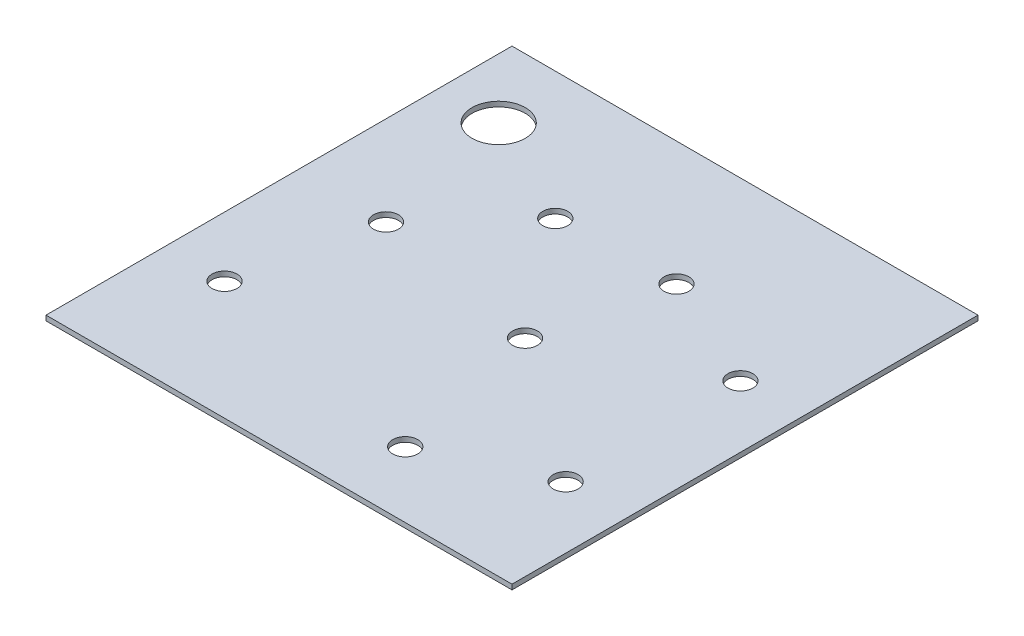
ISO-10303-21;
HEADER;
FILE_DESCRIPTION(('STEP AP214'),'2;1');
FILE_NAME('part.step','',(''),(''),'','','');
FILE_SCHEMA(('AUTOMOTIVE_DESIGN { 1 0 10303 214 1 1 1 1 }'));
ENDSEC;
DATA;
#1=APPLICATION_CONTEXT('core data for automotive mechanical design processes');
#2=APPLICATION_PROTOCOL_DEFINITION('international standard','automotive_design',2000,#1);
#3=PRODUCT_CONTEXT('',#1,'mechanical');
#4=PRODUCT('Part','Part','',(#3));
#5=PRODUCT_RELATED_PRODUCT_CATEGORY('part','',(#4));
#6=PRODUCT_DEFINITION_FORMATION('','',#4);
#7=PRODUCT_DEFINITION_CONTEXT('part definition',#1,'design');
#8=PRODUCT_DEFINITION('design','',#6,#7);
#9=PRODUCT_DEFINITION_SHAPE('','',#8);
#10=(LENGTH_UNIT() NAMED_UNIT(*) SI_UNIT(.MILLI.,.METRE.));
#11=(NAMED_UNIT(*) PLANE_ANGLE_UNIT() SI_UNIT($,.RADIAN.));
#12=(NAMED_UNIT(*) SI_UNIT($,.STERADIAN.) SOLID_ANGLE_UNIT());
#13=UNCERTAINTY_MEASURE_WITH_UNIT(LENGTH_MEASURE(1.E-05),#10,'distance_accuracy_value','');
#14=(GEOMETRIC_REPRESENTATION_CONTEXT(3) GLOBAL_UNCERTAINTY_ASSIGNED_CONTEXT((#13)) GLOBAL_UNIT_ASSIGNED_CONTEXT((#10,
#11,#12)) REPRESENTATION_CONTEXT('',''));
#15=CARTESIAN_POINT('',(0.,0.,0.));
#16=DIRECTION('',(0.,0.,1.));
#17=DIRECTION('',(1.,0.,0.));
#18=AXIS2_PLACEMENT_3D('',#15,#16,#17);
#19=CARTESIAN_POINT('',(0.,1.5,0.));
#20=DIRECTION('',(0.,-1.,0.));
#21=DIRECTION('',(0.,0.,-1.));
#22=AXIS2_PLACEMENT_3D('',#19,#20,#21);
#23=PLANE('',#22);
#24=DIRECTION('',(0.,0.,-1.));
#25=VECTOR('',#24,1.);
#26=CARTESIAN_POINT('',(140.,1.5,140.));
#27=LINE('',#26,#25);
#28=CARTESIAN_POINT('',(140.,1.5,140.));
#29=VERTEX_POINT('',#28);
#30=CARTESIAN_POINT('',(140.,1.5,-140.));
#31=VERTEX_POINT('',#30);
#32=EDGE_CURVE('E99',#29,#31,#27,.T.);
#33=ORIENTED_EDGE('',*,*,#32,.T.);
#34=DIRECTION('',(-1.,0.,0.));
#35=VECTOR('',#34,1.);
#36=CARTESIAN_POINT('',(-140.,1.5,-140.));
#37=LINE('',#36,#35);
#38=CARTESIAN_POINT('',(-140.,1.5,-140.));
#39=VERTEX_POINT('',#38);
#40=EDGE_CURVE('E94',#31,#39,#37,.T.);
#41=ORIENTED_EDGE('',*,*,#40,.T.);
#42=DIRECTION('',(0.,0.,1.));
#43=VECTOR('',#42,1.);
#44=CARTESIAN_POINT('',(-140.,1.5,140.));
#45=LINE('',#44,#43);
#46=CARTESIAN_POINT('',(-140.,1.5,140.));
#47=VERTEX_POINT('',#46);
#48=EDGE_CURVE('E97',#39,#47,#45,.T.);
#49=ORIENTED_EDGE('',*,*,#48,.T.);
#50=DIRECTION('',(1.,0.,0.));
#51=VECTOR('',#50,1.);
#52=CARTESIAN_POINT('',(-140.,1.5,140.));
#53=LINE('',#52,#51);
#54=EDGE_CURVE('E64',#47,#29,#53,.T.);
#55=ORIENTED_EDGE('',*,*,#54,.T.);
#56=EDGE_LOOP('',(#33,#41,#49,#55));
#57=FACE_BOUND('',#56,.T.);
#58=CARTESIAN_POINT('',(-104.,1.5,-96.));
#59=DIRECTION('',(0.,1.,0.));
#60=DIRECTION('',(0.,0.,1.));
#61=AXIS2_PLACEMENT_3D('',#58,#59,#60);
#62=CIRCLE('',#61,16.);
#63=CARTESIAN_POINT('',(-104.,1.5,-80.));
#64=VERTEX_POINT('',#63);
#65=EDGE_CURVE('E114',#64,#64,#62,.T.);
#66=ORIENTED_EDGE('',*,*,#65,.F.);
#67=EDGE_LOOP('',(#66));
#68=FACE_BOUND('',#67,.T.);
#69=CARTESIAN_POINT('',(-86.3455044477865,1.5,-10.6300925090027));
#70=DIRECTION('',(0.,1.,0.));
#71=DIRECTION('',(0.,0.,1.));
#72=AXIS2_PLACEMENT_3D('',#69,#70,#71);
#73=CIRCLE('',#72,7.50000000000001);
#74=CARTESIAN_POINT('',(-86.3455044477865,1.5,-3.13009250900271));
#75=VERTEX_POINT('',#74);
#76=EDGE_CURVE('E129',#75,#75,#73,.T.);
#77=ORIENTED_EDGE('',*,*,#76,.F.);
#78=EDGE_LOOP('',(#77));
#79=FACE_BOUND('',#78,.T.);
#80=CARTESIAN_POINT('',(-104.,1.5,68.745612268935));
#81=DIRECTION('',(0.,1.,0.));
#82=DIRECTION('',(0.,0.,1.));
#83=AXIS2_PLACEMENT_3D('',#80,#81,#82);
#84=CIRCLE('',#83,7.50000000000001);
#85=CARTESIAN_POINT('',(-104.,1.5,76.245612268935));
#86=VERTEX_POINT('',#85);
#87=EDGE_CURVE('E135',#86,#86,#84,.T.);
#88=ORIENTED_EDGE('',*,*,#87,.F.);
#89=EDGE_LOOP('',(#88));
#90=FACE_BOUND('',#89,.T.);
#91=CARTESIAN_POINT('',(36.4243113079733,1.5,100.557665156591));
#92=DIRECTION('',(0.,1.,0.));
#93=DIRECTION('',(0.,0.,1.));
#94=AXIS2_PLACEMENT_3D('',#91,#92,#93);
#95=CIRCLE('',#94,7.5);
#96=CARTESIAN_POINT('',(36.4243113079733,1.5,108.057665156591));
#97=VERTEX_POINT('',#96);
#98=EDGE_CURVE('E141',#97,#97,#95,.T.);
#99=ORIENTED_EDGE('',*,*,#98,.F.);
#100=EDGE_LOOP('',(#99));
#101=FACE_BOUND('',#100,.T.);
#102=CARTESIAN_POINT('',(15.8854616280789,1.5,8.05562787646512));
#103=DIRECTION('',(0.,1.,0.));
#104=DIRECTION('',(0.,0.,1.));
#105=AXIS2_PLACEMENT_3D('',#102,#103,#104);
#106=CIRCLE('',#105,7.5);
#107=CARTESIAN_POINT('',(15.8854616280789,1.5,15.5556278764651));
#108=VERTEX_POINT('',#107);
#109=EDGE_CURVE('E147',#108,#108,#106,.T.);
#110=ORIENTED_EDGE('',*,*,#109,.F.);
#111=EDGE_LOOP('',(#110));
#112=FACE_BOUND('',#111,.T.);
#113=CARTESIAN_POINT('',(33.2267289377524,1.5,-65.5847023670324));
#114=DIRECTION('',(0.,1.,0.));
#115=DIRECTION('',(0.,0.,1.));
#116=AXIS2_PLACEMENT_3D('',#113,#114,#115);
#117=CIRCLE('',#116,7.5);
#118=CARTESIAN_POINT('',(33.2267289377524,1.5,-58.0847023670324));
#119=VERTEX_POINT('',#118);
#120=EDGE_CURVE('E153',#119,#119,#117,.T.);
#121=ORIENTED_EDGE('',*,*,#120,.F.);
#122=EDGE_LOOP('',(#121));
#123=FACE_BOUND('',#122,.T.);
#124=CARTESIAN_POINT('',(102.828111024925,1.5,-34.4119184541435));
#125=DIRECTION('',(0.,1.,0.));
#126=DIRECTION('',(0.,0.,1.));
#127=AXIS2_PLACEMENT_3D('',#124,#125,#126);
#128=CIRCLE('',#127,7.50000000000001);
#129=CARTESIAN_POINT('',(102.828111024925,1.5,-26.9119184541435));
#130=VERTEX_POINT('',#129);
#131=EDGE_CURVE('E159',#130,#130,#128,.T.);
#132=ORIENTED_EDGE('',*,*,#131,.F.);
#133=EDGE_LOOP('',(#132));
#134=FACE_BOUND('',#133,.T.);
#135=CARTESIAN_POINT('',(102.828111024925,1.5,70.5987415633617));
#136=DIRECTION('',(0.,1.,0.));
#137=DIRECTION('',(0.,0.,1.));
#138=AXIS2_PLACEMENT_3D('',#135,#136,#137);
#139=CIRCLE('',#138,7.50000000000001);
#140=CARTESIAN_POINT('',(102.828111024925,1.5,78.0987415633617));
#141=VERTEX_POINT('',#140);
#142=EDGE_CURVE('E165',#141,#141,#139,.T.);
#143=ORIENTED_EDGE('',*,*,#142,.F.);
#144=EDGE_LOOP('',(#143));
#145=FACE_BOUND('',#144,.T.);
#146=CARTESIAN_POINT('',(-37.2960519367656,1.5,-63.2892870863749));
#147=DIRECTION('',(0.,1.,0.));
#148=DIRECTION('',(0.,0.,1.));
#149=AXIS2_PLACEMENT_3D('',#146,#147,#148);
#150=CIRCLE('',#149,7.5);
#151=CARTESIAN_POINT('',(-37.2960519367656,1.5,-55.7892870863749));
#152=VERTEX_POINT('',#151);
#153=EDGE_CURVE('E171',#152,#152,#150,.T.);
#154=ORIENTED_EDGE('',*,*,#153,.F.);
#155=EDGE_LOOP('',(#154));
#156=FACE_BOUND('',#155,.T.);
#157=ADVANCED_FACE('F47',(#57,#68,#79,#90,#101,#112,#123,#134,#145,#156),#23,.F.);
#158=CARTESIAN_POINT('',(0.,-1.5,0.));
#159=DIRECTION('',(0.,-1.,0.));
#160=DIRECTION('',(0.,0.,-1.));
#161=AXIS2_PLACEMENT_3D('',#158,#159,#160);
#162=PLANE('',#161);
#163=CARTESIAN_POINT('',(102.828111024925,-1.5,70.5987415633617));
#164=DIRECTION('',(0.,1.,0.));
#165=DIRECTION('',(0.,0.,1.));
#166=AXIS2_PLACEMENT_3D('',#163,#164,#165);
#167=CIRCLE('',#166,7.50000000000001);
#168=CARTESIAN_POINT('',(102.828111024925,-1.5,78.0987415633617));
#169=VERTEX_POINT('',#168);
#170=EDGE_CURVE('E168',#169,#169,#167,.T.);
#171=ORIENTED_EDGE('',*,*,#170,.T.);
#172=EDGE_LOOP('',(#171));
#173=FACE_BOUND('',#172,.T.);
#174=CARTESIAN_POINT('',(33.2267289377524,-1.5,-65.5847023670324));
#175=DIRECTION('',(0.,1.,0.));
#176=DIRECTION('',(0.,0.,1.));
#177=AXIS2_PLACEMENT_3D('',#174,#175,#176);
#178=CIRCLE('',#177,7.5);
#179=CARTESIAN_POINT('',(33.2267289377524,-1.5,-58.0847023670324));
#180=VERTEX_POINT('',#179);
#181=EDGE_CURVE('E156',#180,#180,#178,.T.);
#182=ORIENTED_EDGE('',*,*,#181,.T.);
#183=EDGE_LOOP('',(#182));
#184=FACE_BOUND('',#183,.T.);
#185=CARTESIAN_POINT('',(36.4243113079733,-1.5,100.557665156591));
#186=DIRECTION('',(0.,1.,0.));
#187=DIRECTION('',(0.,0.,1.));
#188=AXIS2_PLACEMENT_3D('',#185,#186,#187);
#189=CIRCLE('',#188,7.5);
#190=CARTESIAN_POINT('',(36.4243113079733,-1.5,108.057665156591));
#191=VERTEX_POINT('',#190);
#192=EDGE_CURVE('E144',#191,#191,#189,.T.);
#193=ORIENTED_EDGE('',*,*,#192,.T.);
#194=EDGE_LOOP('',(#193));
#195=FACE_BOUND('',#194,.T.);
#196=CARTESIAN_POINT('',(-86.3455044477865,-1.5,-10.6300925090027));
#197=DIRECTION('',(0.,1.,0.));
#198=DIRECTION('',(0.,0.,1.));
#199=AXIS2_PLACEMENT_3D('',#196,#197,#198);
#200=CIRCLE('',#199,7.50000000000001);
#201=CARTESIAN_POINT('',(-86.3455044477865,-1.5,-3.13009250900271));
#202=VERTEX_POINT('',#201);
#203=EDGE_CURVE('E132',#202,#202,#200,.T.);
#204=ORIENTED_EDGE('',*,*,#203,.T.);
#205=EDGE_LOOP('',(#204));
#206=FACE_BOUND('',#205,.T.);
#207=DIRECTION('',(0.,0.,-1.));
#208=VECTOR('',#207,1.);
#209=CARTESIAN_POINT('',(140.,-1.5,140.));
#210=LINE('',#209,#208);
#211=CARTESIAN_POINT('',(140.,-1.5,140.));
#212=VERTEX_POINT('',#211);
#213=CARTESIAN_POINT('',(140.,-1.5,-140.));
#214=VERTEX_POINT('',#213);
#215=EDGE_CURVE('E111',#212,#214,#210,.T.);
#216=ORIENTED_EDGE('',*,*,#215,.F.);
#217=DIRECTION('',(1.,0.,0.));
#218=VECTOR('',#217,1.);
#219=CARTESIAN_POINT('',(-140.,-1.5,140.));
#220=LINE('',#219,#218);
#221=CARTESIAN_POINT('',(-140.,-1.5,140.));
#222=VERTEX_POINT('',#221);
#223=EDGE_CURVE('E87',#222,#212,#220,.T.);
#224=ORIENTED_EDGE('',*,*,#223,.F.);
#225=DIRECTION('',(0.,0.,1.));
#226=VECTOR('',#225,1.);
#227=CARTESIAN_POINT('',(-140.,-1.5,140.));
#228=LINE('',#227,#226);
#229=CARTESIAN_POINT('',(-140.,-1.5,-140.));
#230=VERTEX_POINT('',#229);
#231=EDGE_CURVE('E81',#230,#222,#228,.T.);
#232=ORIENTED_EDGE('',*,*,#231,.F.);
#233=DIRECTION('',(-1.,0.,0.));
#234=VECTOR('',#233,1.);
#235=CARTESIAN_POINT('',(-140.,-1.5,-140.));
#236=LINE('',#235,#234);
#237=EDGE_CURVE('E103',#214,#230,#236,.T.);
#238=ORIENTED_EDGE('',*,*,#237,.F.);
#239=EDGE_LOOP('',(#216,#224,#232,#238));
#240=FACE_BOUND('',#239,.T.);
#241=CARTESIAN_POINT('',(-104.,-1.5,-96.));
#242=DIRECTION('',(0.,1.,0.));
#243=DIRECTION('',(0.,0.,1.));
#244=AXIS2_PLACEMENT_3D('',#241,#242,#243);
#245=CIRCLE('',#244,16.);
#246=CARTESIAN_POINT('',(-104.,-1.5,-80.));
#247=VERTEX_POINT('',#246);
#248=EDGE_CURVE('E126',#247,#247,#245,.T.);
#249=ORIENTED_EDGE('',*,*,#248,.T.);
#250=EDGE_LOOP('',(#249));
#251=FACE_BOUND('',#250,.T.);
#252=CARTESIAN_POINT('',(-104.,-1.5,68.745612268935));
#253=DIRECTION('',(0.,1.,0.));
#254=DIRECTION('',(0.,0.,1.));
#255=AXIS2_PLACEMENT_3D('',#252,#253,#254);
#256=CIRCLE('',#255,7.50000000000001);
#257=CARTESIAN_POINT('',(-104.,-1.5,76.245612268935));
#258=VERTEX_POINT('',#257);
#259=EDGE_CURVE('E138',#258,#258,#256,.T.);
#260=ORIENTED_EDGE('',*,*,#259,.T.);
#261=EDGE_LOOP('',(#260));
#262=FACE_BOUND('',#261,.T.);
#263=CARTESIAN_POINT('',(15.8854616280789,-1.5,8.05562787646512));
#264=DIRECTION('',(0.,1.,0.));
#265=DIRECTION('',(0.,0.,1.));
#266=AXIS2_PLACEMENT_3D('',#263,#264,#265);
#267=CIRCLE('',#266,7.5);
#268=CARTESIAN_POINT('',(15.8854616280789,-1.5,15.5556278764651));
#269=VERTEX_POINT('',#268);
#270=EDGE_CURVE('E150',#269,#269,#267,.T.);
#271=ORIENTED_EDGE('',*,*,#270,.T.);
#272=EDGE_LOOP('',(#271));
#273=FACE_BOUND('',#272,.T.);
#274=CARTESIAN_POINT('',(102.828111024925,-1.5,-34.4119184541435));
#275=DIRECTION('',(0.,1.,0.));
#276=DIRECTION('',(0.,0.,1.));
#277=AXIS2_PLACEMENT_3D('',#274,#275,#276);
#278=CIRCLE('',#277,7.50000000000001);
#279=CARTESIAN_POINT('',(102.828111024925,-1.5,-26.9119184541435));
#280=VERTEX_POINT('',#279);
#281=EDGE_CURVE('E162',#280,#280,#278,.T.);
#282=ORIENTED_EDGE('',*,*,#281,.T.);
#283=EDGE_LOOP('',(#282));
#284=FACE_BOUND('',#283,.T.);
#285=CARTESIAN_POINT('',(-37.2960519367656,-1.5,-63.2892870863749));
#286=DIRECTION('',(0.,1.,0.));
#287=DIRECTION('',(0.,0.,1.));
#288=AXIS2_PLACEMENT_3D('',#285,#286,#287);
#289=CIRCLE('',#288,7.5);
#290=CARTESIAN_POINT('',(-37.2960519367656,-1.5,-55.7892870863749));
#291=VERTEX_POINT('',#290);
#292=EDGE_CURVE('E174',#291,#291,#289,.T.);
#293=ORIENTED_EDGE('',*,*,#292,.T.);
#294=EDGE_LOOP('',(#293));
#295=FACE_BOUND('',#294,.T.);
#296=ADVANCED_FACE('F122',(#173,#184,#195,#206,#240,#251,#262,#273,#284,#295),#162,.T.);
#297=CARTESIAN_POINT('',(140.,1.5,140.));
#298=DIRECTION('',(-1.,0.,0.));
#299=DIRECTION('',(0.,0.,1.));
#300=AXIS2_PLACEMENT_3D('',#297,#298,#299);
#301=PLANE('',#300);
#302=ORIENTED_EDGE('',*,*,#215,.T.);
#303=DIRECTION('',(0.,-1.,0.));
#304=VECTOR('',#303,1.);
#305=CARTESIAN_POINT('',(140.,1.5,-140.));
#306=LINE('',#305,#304);
#307=EDGE_CURVE('E11',#31,#214,#306,.T.);
#308=ORIENTED_EDGE('',*,*,#307,.F.);
#309=ORIENTED_EDGE('',*,*,#32,.F.);
#310=DIRECTION('',(0.,-1.,0.));
#311=VECTOR('',#310,1.);
#312=CARTESIAN_POINT('',(140.,1.5,140.));
#313=LINE('',#312,#311);
#314=EDGE_CURVE('E107',#29,#212,#313,.T.);
#315=ORIENTED_EDGE('',*,*,#314,.T.);
#316=EDGE_LOOP('',(#302,#308,#309,#315));
#317=FACE_BOUND('',#316,.T.);
#318=ADVANCED_FACE('F49',(#317),#301,.F.);
#319=CARTESIAN_POINT('',(-140.,1.5,-140.));
#320=DIRECTION('',(0.,0.,1.));
#321=DIRECTION('',(1.,0.,0.));
#322=AXIS2_PLACEMENT_3D('',#319,#320,#321);
#323=PLANE('',#322);
#324=ORIENTED_EDGE('',*,*,#237,.T.);
#325=DIRECTION('',(0.,-1.,0.));
#326=VECTOR('',#325,1.);
#327=CARTESIAN_POINT('',(-140.,1.5,-140.));
#328=LINE('',#327,#326);
#329=EDGE_CURVE('E56',#39,#230,#328,.T.);
#330=ORIENTED_EDGE('',*,*,#329,.F.);
#331=ORIENTED_EDGE('',*,*,#40,.F.);
#332=ORIENTED_EDGE('',*,*,#307,.T.);
#333=EDGE_LOOP('',(#324,#330,#331,#332));
#334=FACE_BOUND('',#333,.T.);
#335=ADVANCED_FACE('F102',(#334),#323,.F.);
#336=CARTESIAN_POINT('',(-140.,1.5,140.));
#337=DIRECTION('',(1.,0.,0.));
#338=DIRECTION('',(0.,0.,-1.));
#339=AXIS2_PLACEMENT_3D('',#336,#337,#338);
#340=PLANE('',#339);
#341=ORIENTED_EDGE('',*,*,#231,.T.);
#342=DIRECTION('',(0.,-1.,0.));
#343=VECTOR('',#342,1.);
#344=CARTESIAN_POINT('',(-140.,1.5,140.));
#345=LINE('',#344,#343);
#346=EDGE_CURVE('E104',#47,#222,#345,.T.);
#347=ORIENTED_EDGE('',*,*,#346,.F.);
#348=ORIENTED_EDGE('',*,*,#48,.F.);
#349=ORIENTED_EDGE('',*,*,#329,.T.);
#350=EDGE_LOOP('',(#341,#347,#348,#349));
#351=FACE_BOUND('',#350,.T.);
#352=ADVANCED_FACE('F105',(#351),#340,.F.);
#353=CARTESIAN_POINT('',(-140.,1.5,140.));
#354=DIRECTION('',(0.,0.,-1.));
#355=DIRECTION('',(-1.,0.,0.));
#356=AXIS2_PLACEMENT_3D('',#353,#354,#355);
#357=PLANE('',#356);
#358=ORIENTED_EDGE('',*,*,#223,.T.);
#359=ORIENTED_EDGE('',*,*,#314,.F.);
#360=ORIENTED_EDGE('',*,*,#54,.F.);
#361=ORIENTED_EDGE('',*,*,#346,.T.);
#362=EDGE_LOOP('',(#358,#359,#360,#361));
#363=FACE_BOUND('',#362,.T.);
#364=ADVANCED_FACE('F119',(#363),#357,.F.);
#365=CARTESIAN_POINT('',(-104.,1.5,-96.));
#366=DIRECTION('',(0.,-1.,0.));
#367=DIRECTION('',(0.,0.,-1.));
#368=AXIS2_PLACEMENT_3D('',#365,#366,#367);
#369=CYLINDRICAL_SURFACE('',#368,16.);
#370=ORIENTED_EDGE('',*,*,#65,.T.);
#371=EDGE_LOOP('',(#370));
#372=FACE_BOUND('',#371,.T.);
#373=ORIENTED_EDGE('',*,*,#248,.F.);
#374=EDGE_LOOP('',(#373));
#375=FACE_BOUND('',#374,.T.);
#376=ADVANCED_FACE('F192',(#372,#375),#369,.F.);
#377=CARTESIAN_POINT('',(-86.3455044477865,1.5,-10.6300925090027));
#378=DIRECTION('',(0.,-1.,0.));
#379=DIRECTION('',(0.,0.,-1.));
#380=AXIS2_PLACEMENT_3D('',#377,#378,#379);
#381=CYLINDRICAL_SURFACE('',#380,7.50000000000001);
#382=ORIENTED_EDGE('',*,*,#76,.T.);
#383=EDGE_LOOP('',(#382));
#384=FACE_BOUND('',#383,.T.);
#385=ORIENTED_EDGE('',*,*,#203,.F.);
#386=EDGE_LOOP('',(#385));
#387=FACE_BOUND('',#386,.T.);
#388=ADVANCED_FACE('F260',(#384,#387),#381,.F.);
#389=CARTESIAN_POINT('',(-104.,1.5,68.745612268935));
#390=DIRECTION('',(0.,-1.,0.));
#391=DIRECTION('',(0.,0.,-1.));
#392=AXIS2_PLACEMENT_3D('',#389,#390,#391);
#393=CYLINDRICAL_SURFACE('',#392,7.50000000000001);
#394=ORIENTED_EDGE('',*,*,#87,.T.);
#395=EDGE_LOOP('',(#394));
#396=FACE_BOUND('',#395,.T.);
#397=ORIENTED_EDGE('',*,*,#259,.F.);
#398=EDGE_LOOP('',(#397));
#399=FACE_BOUND('',#398,.T.);
#400=ADVANCED_FACE('F268',(#396,#399),#393,.F.);
#401=CARTESIAN_POINT('',(36.4243113079733,1.5,100.557665156591));
#402=DIRECTION('',(0.,-1.,0.));
#403=DIRECTION('',(0.,0.,-1.));
#404=AXIS2_PLACEMENT_3D('',#401,#402,#403);
#405=CYLINDRICAL_SURFACE('',#404,7.5);
#406=ORIENTED_EDGE('',*,*,#98,.T.);
#407=EDGE_LOOP('',(#406));
#408=FACE_BOUND('',#407,.T.);
#409=ORIENTED_EDGE('',*,*,#192,.F.);
#410=EDGE_LOOP('',(#409));
#411=FACE_BOUND('',#410,.T.);
#412=ADVANCED_FACE('F276',(#408,#411),#405,.F.);
#413=CARTESIAN_POINT('',(15.8854616280789,1.5,8.05562787646512));
#414=DIRECTION('',(0.,-1.,0.));
#415=DIRECTION('',(0.,0.,-1.));
#416=AXIS2_PLACEMENT_3D('',#413,#414,#415);
#417=CYLINDRICAL_SURFACE('',#416,7.5);
#418=ORIENTED_EDGE('',*,*,#109,.T.);
#419=EDGE_LOOP('',(#418));
#420=FACE_BOUND('',#419,.T.);
#421=ORIENTED_EDGE('',*,*,#270,.F.);
#422=EDGE_LOOP('',(#421));
#423=FACE_BOUND('',#422,.T.);
#424=ADVANCED_FACE('F285',(#420,#423),#417,.F.);
#425=CARTESIAN_POINT('',(33.2267289377524,1.5,-65.5847023670324));
#426=DIRECTION('',(0.,-1.,0.));
#427=DIRECTION('',(0.,0.,-1.));
#428=AXIS2_PLACEMENT_3D('',#425,#426,#427);
#429=CYLINDRICAL_SURFACE('',#428,7.5);
#430=ORIENTED_EDGE('',*,*,#120,.T.);
#431=EDGE_LOOP('',(#430));
#432=FACE_BOUND('',#431,.T.);
#433=ORIENTED_EDGE('',*,*,#181,.F.);
#434=EDGE_LOOP('',(#433));
#435=FACE_BOUND('',#434,.T.);
#436=ADVANCED_FACE('F294',(#432,#435),#429,.F.);
#437=CARTESIAN_POINT('',(102.828111024925,1.5,-34.4119184541435));
#438=DIRECTION('',(0.,-1.,0.));
#439=DIRECTION('',(0.,0.,-1.));
#440=AXIS2_PLACEMENT_3D('',#437,#438,#439);
#441=CYLINDRICAL_SURFACE('',#440,7.50000000000001);
#442=ORIENTED_EDGE('',*,*,#131,.T.);
#443=EDGE_LOOP('',(#442));
#444=FACE_BOUND('',#443,.T.);
#445=ORIENTED_EDGE('',*,*,#281,.F.);
#446=EDGE_LOOP('',(#445));
#447=FACE_BOUND('',#446,.T.);
#448=ADVANCED_FACE('F303',(#444,#447),#441,.F.);
#449=CARTESIAN_POINT('',(102.828111024925,1.5,70.5987415633617));
#450=DIRECTION('',(0.,-1.,0.));
#451=DIRECTION('',(0.,0.,-1.));
#452=AXIS2_PLACEMENT_3D('',#449,#450,#451);
#453=CYLINDRICAL_SURFACE('',#452,7.50000000000001);
#454=ORIENTED_EDGE('',*,*,#142,.T.);
#455=EDGE_LOOP('',(#454));
#456=FACE_BOUND('',#455,.T.);
#457=ORIENTED_EDGE('',*,*,#170,.F.);
#458=EDGE_LOOP('',(#457));
#459=FACE_BOUND('',#458,.T.);
#460=ADVANCED_FACE('F312',(#456,#459),#453,.F.);
#461=CARTESIAN_POINT('',(-37.2960519367656,1.5,-63.2892870863749));
#462=DIRECTION('',(0.,-1.,0.));
#463=DIRECTION('',(0.,0.,-1.));
#464=AXIS2_PLACEMENT_3D('',#461,#462,#463);
#465=CYLINDRICAL_SURFACE('',#464,7.5);
#466=ORIENTED_EDGE('',*,*,#153,.T.);
#467=EDGE_LOOP('',(#466));
#468=FACE_BOUND('',#467,.T.);
#469=ORIENTED_EDGE('',*,*,#292,.F.);
#470=EDGE_LOOP('',(#469));
#471=FACE_BOUND('',#470,.T.);
#472=ADVANCED_FACE('F180',(#468,#471),#465,.F.);
#473=CLOSED_SHELL('',(#157,#296,#318,#335,#352,#364,#376,#388,#400,#412,#424,#436,#448,#460,#472));
#474=MANIFOLD_SOLID_BREP('B2',#473);
#475=ADVANCED_BREP_SHAPE_REPRESENTATION('',(#18,#474),#14);
#476=SHAPE_DEFINITION_REPRESENTATION(#9,#475);
ENDSEC;
END-ISO-10303-21;
